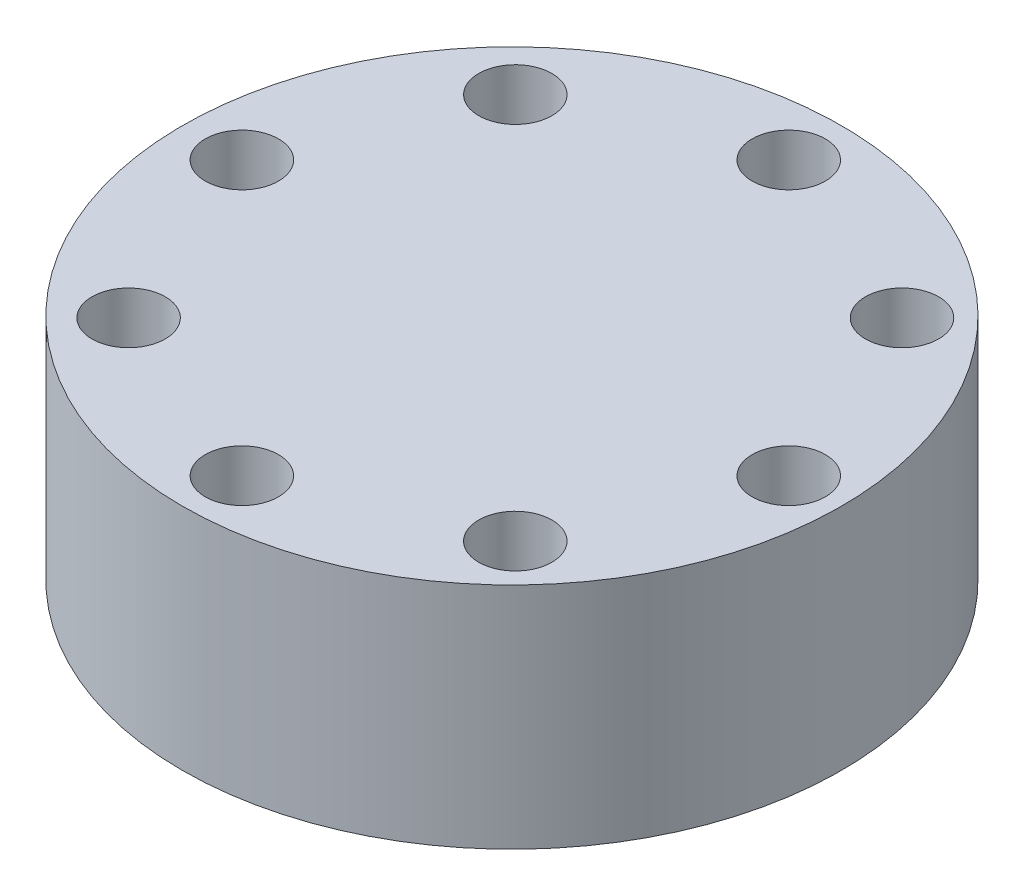
ISO-10303-21;
HEADER;
FILE_DESCRIPTION(('STEP AP214'),'2;1');
FILE_NAME('part.step','',(''),(''),'','','');
FILE_SCHEMA(('AUTOMOTIVE_DESIGN { 1 0 10303 214 1 1 1 1 }'));
ENDSEC;
DATA;
#1=APPLICATION_CONTEXT('core data for automotive mechanical design processes');
#2=APPLICATION_PROTOCOL_DEFINITION('international standard','automotive_design',2000,#1);
#3=PRODUCT_CONTEXT('',#1,'mechanical');
#4=PRODUCT('Part','Part','',(#3));
#5=PRODUCT_RELATED_PRODUCT_CATEGORY('part','',(#4));
#6=PRODUCT_DEFINITION_FORMATION('','',#4);
#7=PRODUCT_DEFINITION_CONTEXT('part definition',#1,'design');
#8=PRODUCT_DEFINITION('design','',#6,#7);
#9=PRODUCT_DEFINITION_SHAPE('','',#8);
#10=(LENGTH_UNIT() NAMED_UNIT(*) SI_UNIT(.MILLI.,.METRE.));
#11=(NAMED_UNIT(*) PLANE_ANGLE_UNIT() SI_UNIT($,.RADIAN.));
#12=(NAMED_UNIT(*) SI_UNIT($,.STERADIAN.) SOLID_ANGLE_UNIT());
#13=UNCERTAINTY_MEASURE_WITH_UNIT(LENGTH_MEASURE(1.E-05),#10,'distance_accuracy_value','');
#14=(GEOMETRIC_REPRESENTATION_CONTEXT(3) GLOBAL_UNCERTAINTY_ASSIGNED_CONTEXT((#13)) GLOBAL_UNIT_ASSIGNED_CONTEXT((#10,
#11,#12)) REPRESENTATION_CONTEXT('',''));
#15=CARTESIAN_POINT('',(0.,0.,0.));
#16=DIRECTION('',(0.,0.,1.));
#17=DIRECTION('',(1.,0.,0.));
#18=AXIS2_PLACEMENT_3D('',#15,#16,#17);
#19=CARTESIAN_POINT('',(0.,25.,0.));
#20=DIRECTION('',(0.,-1.,0.));
#21=DIRECTION('',(0.,0.,-1.));
#22=AXIS2_PLACEMENT_3D('',#19,#20,#21);
#23=CYLINDRICAL_SURFACE('',#22,36.);
#24=CARTESIAN_POINT('',(0.,25.,0.));
#25=DIRECTION('',(0.,1.,0.));
#26=DIRECTION('',(0.,0.,1.));
#27=AXIS2_PLACEMENT_3D('',#24,#25,#26);
#28=CIRCLE('',#27,36.);
#29=CARTESIAN_POINT('',(0.,25.,36.));
#30=VERTEX_POINT('',#29);
#31=EDGE_CURVE('E10',#30,#30,#28,.T.);
#32=ORIENTED_EDGE('',*,*,#31,.F.);
#33=EDGE_LOOP('',(#32));
#34=FACE_BOUND('',#33,.T.);
#35=CARTESIAN_POINT('',(0.,0.,0.));
#36=DIRECTION('',(0.,1.,0.));
#37=DIRECTION('',(0.,0.,1.));
#38=AXIS2_PLACEMENT_3D('',#35,#36,#37);
#39=CIRCLE('',#38,36.);
#40=CARTESIAN_POINT('',(0.,0.,36.));
#41=VERTEX_POINT('',#40);
#42=EDGE_CURVE('E44',#41,#41,#39,.T.);
#43=ORIENTED_EDGE('',*,*,#42,.T.);
#44=EDGE_LOOP('',(#43));
#45=FACE_BOUND('',#44,.T.);
#46=ADVANCED_FACE('F41',(#34,#45),#23,.T.);
#47=CARTESIAN_POINT('',(0.,25.,0.));
#48=DIRECTION('',(0.,1.,0.));
#49=DIRECTION('',(0.,0.,1.));
#50=AXIS2_PLACEMENT_3D('',#47,#48,#49);
#51=PLANE('',#50);
#52=CARTESIAN_POINT('',(0.368750000000097,25.,29.86875));
#53=DIRECTION('',(0.,1.,0.));
#54=DIRECTION('',(1.,0.,0.));
#55=AXIS2_PLACEMENT_3D('',#52,#53,#54);
#56=CIRCLE('',#55,4.);
#57=CARTESIAN_POINT('',(4.3687500000001,25.,29.86875));
#58=VERTEX_POINT('',#57);
#59=EDGE_CURVE('E96',#58,#58,#56,.T.);
#60=ORIENTED_EDGE('',*,*,#59,.F.);
#61=EDGE_LOOP('',(#60));
#62=FACE_BOUND('',#61,.T.);
#63=CARTESIAN_POINT('',(21.4891456705658,25.,21.1203956705656));
#64=DIRECTION('',(0.,1.,0.));
#65=DIRECTION('',(0.707106781186544,0.,-0.707106781186551));
#66=AXIS2_PLACEMENT_3D('',#63,#64,#65);
#67=CIRCLE('',#66,4.);
#68=CARTESIAN_POINT('',(24.317572795312,25.,18.2919685458194));
#69=VERTEX_POINT('',#68);
#70=EDGE_CURVE('E88',#69,#69,#67,.T.);
#71=ORIENTED_EDGE('',*,*,#70,.F.);
#72=EDGE_LOOP('',(#71));
#73=FACE_BOUND('',#72,.T.);
#74=CARTESIAN_POINT('',(30.2375,25.,0.));
#75=DIRECTION('',(0.,1.,0.));
#76=DIRECTION('',(0.,0.,-1.));
#77=AXIS2_PLACEMENT_3D('',#74,#75,#76);
#78=CIRCLE('',#77,4.);
#79=CARTESIAN_POINT('',(30.2375,25.,-3.99999999999999));
#80=VERTEX_POINT('',#79);
#81=EDGE_CURVE('E80',#80,#80,#78,.T.);
#82=ORIENTED_EDGE('',*,*,#81,.F.);
#83=EDGE_LOOP('',(#82));
#84=FACE_BOUND('',#83,.T.);
#85=CARTESIAN_POINT('',(21.4891456705655,25.,-21.1203956705659));
#86=DIRECTION('',(0.,1.,0.));
#87=DIRECTION('',(-0.707106781186554,0.,-0.707106781186541));
#88=AXIS2_PLACEMENT_3D('',#85,#86,#87);
#89=CIRCLE('',#88,4.);
#90=CARTESIAN_POINT('',(18.6607185458193,25.,-23.948822795312));
#91=VERTEX_POINT('',#90);
#92=EDGE_CURVE('E71',#91,#91,#89,.T.);
#93=ORIENTED_EDGE('',*,*,#92,.F.);
#94=EDGE_LOOP('',(#93));
#95=FACE_BOUND('',#94,.T.);
#96=CARTESIAN_POINT('',(0.368749999999693,25.,-29.86875));
#97=DIRECTION('',(0.,1.,0.));
#98=DIRECTION('',(-1.,0.,0.));
#99=AXIS2_PLACEMENT_3D('',#96,#97,#98);
#100=CIRCLE('',#99,4.);
#101=CARTESIAN_POINT('',(-3.63125000000031,25.,-29.86875));
#102=VERTEX_POINT('',#101);
#103=EDGE_CURVE('E111',#102,#102,#100,.T.);
#104=ORIENTED_EDGE('',*,*,#103,.F.);
#105=EDGE_LOOP('',(#104));
#106=FACE_BOUND('',#105,.T.);
#107=CARTESIAN_POINT('',(-20.7516456705659,25.,-21.1203956705654));
#108=DIRECTION('',(0.,1.,0.));
#109=DIRECTION('',(-0.707106781186539,0.,0.707106781186556));
#110=AXIS2_PLACEMENT_3D('',#107,#108,#109);
#111=CIRCLE('',#110,4.);
#112=CARTESIAN_POINT('',(-23.5800727953121,25.,-18.2919685458192));
#113=VERTEX_POINT('',#112);
#114=EDGE_CURVE('E103',#113,#113,#111,.T.);
#115=ORIENTED_EDGE('',*,*,#114,.F.);
#116=EDGE_LOOP('',(#115));
#117=FACE_BOUND('',#116,.T.);
#118=CARTESIAN_POINT('',(-20.7516456705657,25.,21.1203956705657));
#119=DIRECTION('',(0.,1.,0.));
#120=DIRECTION('',(0.707106781186549,0.,0.707106781186546));
#121=AXIS2_PLACEMENT_3D('',#118,#119,#120);
#122=CIRCLE('',#121,4.);
#123=CARTESIAN_POINT('',(-17.9232185458195,25.,23.9488227953119));
#124=VERTEX_POINT('',#123);
#125=EDGE_CURVE('E63',#124,#124,#122,.T.);
#126=ORIENTED_EDGE('',*,*,#125,.F.);
#127=EDGE_LOOP('',(#126));
#128=FACE_BOUND('',#127,.T.);
#129=CARTESIAN_POINT('',(-29.5,25.,0.));
#130=DIRECTION('',(0.,1.,0.));
#131=DIRECTION('',(0.,0.,1.));
#132=AXIS2_PLACEMENT_3D('',#129,#130,#131);
#133=CIRCLE('',#132,4.);
#134=CARTESIAN_POINT('',(-29.5,25.,4.));
#135=VERTEX_POINT('',#134);
#136=EDGE_CURVE('E55',#135,#135,#133,.T.);
#137=ORIENTED_EDGE('',*,*,#136,.F.);
#138=EDGE_LOOP('',(#137));
#139=FACE_BOUND('',#138,.T.);
#140=ORIENTED_EDGE('',*,*,#31,.T.);
#141=EDGE_LOOP('',(#140));
#142=FACE_BOUND('',#141,.T.);
#143=ADVANCED_FACE('F130',(#62,#73,#84,#95,#106,#117,#128,#139,#142),#51,.T.);
#144=CARTESIAN_POINT('',(0.,0.,0.));
#145=DIRECTION('',(0.,1.,0.));
#146=DIRECTION('',(0.,0.,1.));
#147=AXIS2_PLACEMENT_3D('',#144,#145,#146);
#148=PLANE('',#147);
#149=CARTESIAN_POINT('',(0.368750000000097,0.,29.86875));
#150=DIRECTION('',(0.,1.,0.));
#151=DIRECTION('',(1.,0.,0.));
#152=AXIS2_PLACEMENT_3D('',#149,#150,#151);
#153=CIRCLE('',#152,4.);
#154=CARTESIAN_POINT('',(4.3687500000001,0.,29.86875));
#155=VERTEX_POINT('',#154);
#156=EDGE_CURVE('E67',#155,#155,#153,.T.);
#157=ORIENTED_EDGE('',*,*,#156,.T.);
#158=EDGE_LOOP('',(#157));
#159=FACE_BOUND('',#158,.T.);
#160=CARTESIAN_POINT('',(21.4891456705658,0.,21.1203956705656));
#161=DIRECTION('',(0.,1.,0.));
#162=DIRECTION('',(0.707106781186544,0.,-0.707106781186551));
#163=AXIS2_PLACEMENT_3D('',#160,#161,#162);
#164=CIRCLE('',#163,4.);
#165=CARTESIAN_POINT('',(24.317572795312,0.,18.2919685458194));
#166=VERTEX_POINT('',#165);
#167=EDGE_CURVE('E92',#166,#166,#164,.T.);
#168=ORIENTED_EDGE('',*,*,#167,.T.);
#169=EDGE_LOOP('',(#168));
#170=FACE_BOUND('',#169,.T.);
#171=CARTESIAN_POINT('',(30.2375,0.,0.));
#172=DIRECTION('',(0.,1.,0.));
#173=DIRECTION('',(0.,0.,-1.));
#174=AXIS2_PLACEMENT_3D('',#171,#172,#173);
#175=CIRCLE('',#174,4.);
#176=CARTESIAN_POINT('',(30.2375,0.,-3.99999999999999));
#177=VERTEX_POINT('',#176);
#178=EDGE_CURVE('E84',#177,#177,#175,.T.);
#179=ORIENTED_EDGE('',*,*,#178,.T.);
#180=EDGE_LOOP('',(#179));
#181=FACE_BOUND('',#180,.T.);
#182=CARTESIAN_POINT('',(21.4891456705655,0.,-21.1203956705659));
#183=DIRECTION('',(0.,1.,0.));
#184=DIRECTION('',(-0.707106781186554,0.,-0.707106781186541));
#185=AXIS2_PLACEMENT_3D('',#182,#183,#184);
#186=CIRCLE('',#185,4.);
#187=CARTESIAN_POINT('',(18.6607185458193,0.,-23.948822795312));
#188=VERTEX_POINT('',#187);
#189=EDGE_CURVE('E75',#188,#188,#186,.T.);
#190=ORIENTED_EDGE('',*,*,#189,.T.);
#191=EDGE_LOOP('',(#190));
#192=FACE_BOUND('',#191,.T.);
#193=CARTESIAN_POINT('',(0.368749999999693,0.,-29.86875));
#194=DIRECTION('',(0.,1.,0.));
#195=DIRECTION('',(-1.,0.,0.));
#196=AXIS2_PLACEMENT_3D('',#193,#194,#195);
#197=CIRCLE('',#196,4.);
#198=CARTESIAN_POINT('',(-3.63125000000031,0.,-29.86875));
#199=VERTEX_POINT('',#198);
#200=EDGE_CURVE('E76',#199,#199,#197,.T.);
#201=ORIENTED_EDGE('',*,*,#200,.T.);
#202=EDGE_LOOP('',(#201));
#203=FACE_BOUND('',#202,.T.);
#204=CARTESIAN_POINT('',(-20.7516456705659,0.,-21.1203956705654));
#205=DIRECTION('',(0.,1.,0.));
#206=DIRECTION('',(-0.707106781186539,0.,0.707106781186556));
#207=AXIS2_PLACEMENT_3D('',#204,#205,#206);
#208=CIRCLE('',#207,4.);
#209=CARTESIAN_POINT('',(-23.5800727953121,0.,-18.2919685458192));
#210=VERTEX_POINT('',#209);
#211=EDGE_CURVE('E107',#210,#210,#208,.T.);
#212=ORIENTED_EDGE('',*,*,#211,.T.);
#213=EDGE_LOOP('',(#212));
#214=FACE_BOUND('',#213,.T.);
#215=CARTESIAN_POINT('',(-20.7516456705657,0.,21.1203956705657));
#216=DIRECTION('',(0.,1.,0.));
#217=DIRECTION('',(0.707106781186549,0.,0.707106781186546));
#218=AXIS2_PLACEMENT_3D('',#215,#216,#217);
#219=CIRCLE('',#218,4.);
#220=CARTESIAN_POINT('',(-17.9232185458195,0.,23.9488227953119));
#221=VERTEX_POINT('',#220);
#222=EDGE_CURVE('E59',#221,#221,#219,.T.);
#223=ORIENTED_EDGE('',*,*,#222,.T.);
#224=EDGE_LOOP('',(#223));
#225=FACE_BOUND('',#224,.T.);
#226=CARTESIAN_POINT('',(-29.5,0.,0.));
#227=DIRECTION('',(0.,1.,0.));
#228=DIRECTION('',(0.,0.,1.));
#229=AXIS2_PLACEMENT_3D('',#226,#227,#228);
#230=CIRCLE('',#229,4.);
#231=CARTESIAN_POINT('',(-29.5,0.,4.));
#232=VERTEX_POINT('',#231);
#233=EDGE_CURVE('E53',#232,#232,#230,.T.);
#234=ORIENTED_EDGE('',*,*,#233,.T.);
#235=EDGE_LOOP('',(#234));
#236=FACE_BOUND('',#235,.T.);
#237=ORIENTED_EDGE('',*,*,#42,.F.);
#238=EDGE_LOOP('',(#237));
#239=FACE_BOUND('',#238,.T.);
#240=ADVANCED_FACE('F119',(#159,#170,#181,#192,#203,#214,#225,#236,#239),#148,.F.);
#241=CARTESIAN_POINT('',(-29.5,0.,0.));
#242=DIRECTION('',(0.,1.,0.));
#243=DIRECTION('',(0.,0.,1.));
#244=AXIS2_PLACEMENT_3D('',#241,#242,#243);
#245=CYLINDRICAL_SURFACE('',#244,4.);
#246=ORIENTED_EDGE('',*,*,#233,.F.);
#247=EDGE_LOOP('',(#246));
#248=FACE_BOUND('',#247,.T.);
#249=ORIENTED_EDGE('',*,*,#136,.T.);
#250=EDGE_LOOP('',(#249));
#251=FACE_BOUND('',#250,.T.);
#252=ADVANCED_FACE('F141',(#248,#251),#245,.F.);
#253=CARTESIAN_POINT('',(-20.7516456705657,0.,21.1203956705657));
#254=DIRECTION('',(0.,1.,0.));
#255=DIRECTION('',(0.,0.,1.));
#256=AXIS2_PLACEMENT_3D('',#253,#254,#255);
#257=CYLINDRICAL_SURFACE('',#256,4.);
#258=ORIENTED_EDGE('',*,*,#222,.F.);
#259=EDGE_LOOP('',(#258));
#260=FACE_BOUND('',#259,.T.);
#261=ORIENTED_EDGE('',*,*,#125,.T.);
#262=EDGE_LOOP('',(#261));
#263=FACE_BOUND('',#262,.T.);
#264=ADVANCED_FACE('F143',(#260,#263),#257,.F.);
#265=CARTESIAN_POINT('',(-20.7516456705659,0.,-21.1203956705654));
#266=DIRECTION('',(0.,1.,0.));
#267=DIRECTION('',(0.,0.,1.));
#268=AXIS2_PLACEMENT_3D('',#265,#266,#267);
#269=CYLINDRICAL_SURFACE('',#268,4.);
#270=ORIENTED_EDGE('',*,*,#211,.F.);
#271=EDGE_LOOP('',(#270));
#272=FACE_BOUND('',#271,.T.);
#273=ORIENTED_EDGE('',*,*,#114,.T.);
#274=EDGE_LOOP('',(#273));
#275=FACE_BOUND('',#274,.T.);
#276=ADVANCED_FACE('F126',(#272,#275),#269,.F.);
#277=CARTESIAN_POINT('',(0.368749999999693,0.,-29.86875));
#278=DIRECTION('',(0.,1.,0.));
#279=DIRECTION('',(0.,0.,1.));
#280=AXIS2_PLACEMENT_3D('',#277,#278,#279);
#281=CYLINDRICAL_SURFACE('',#280,4.);
#282=ORIENTED_EDGE('',*,*,#200,.F.);
#283=EDGE_LOOP('',(#282));
#284=FACE_BOUND('',#283,.T.);
#285=ORIENTED_EDGE('',*,*,#103,.T.);
#286=EDGE_LOOP('',(#285));
#287=FACE_BOUND('',#286,.T.);
#288=ADVANCED_FACE('F122',(#284,#287),#281,.F.);
#289=CARTESIAN_POINT('',(21.4891456705655,0.,-21.1203956705659));
#290=DIRECTION('',(0.,1.,0.));
#291=DIRECTION('',(0.,0.,1.));
#292=AXIS2_PLACEMENT_3D('',#289,#290,#291);
#293=CYLINDRICAL_SURFACE('',#292,4.);
#294=ORIENTED_EDGE('',*,*,#189,.F.);
#295=EDGE_LOOP('',(#294));
#296=FACE_BOUND('',#295,.T.);
#297=ORIENTED_EDGE('',*,*,#92,.T.);
#298=EDGE_LOOP('',(#297));
#299=FACE_BOUND('',#298,.T.);
#300=ADVANCED_FACE('F125',(#296,#299),#293,.F.);
#301=CARTESIAN_POINT('',(30.2375,0.,0.));
#302=DIRECTION('',(0.,1.,0.));
#303=DIRECTION('',(0.,0.,1.));
#304=AXIS2_PLACEMENT_3D('',#301,#302,#303);
#305=CYLINDRICAL_SURFACE('',#304,4.);
#306=ORIENTED_EDGE('',*,*,#178,.F.);
#307=EDGE_LOOP('',(#306));
#308=FACE_BOUND('',#307,.T.);
#309=ORIENTED_EDGE('',*,*,#81,.T.);
#310=EDGE_LOOP('',(#309));
#311=FACE_BOUND('',#310,.T.);
#312=ADVANCED_FACE('F204',(#308,#311),#305,.F.);
#313=CARTESIAN_POINT('',(21.4891456705658,0.,21.1203956705656));
#314=DIRECTION('',(0.,1.,0.));
#315=DIRECTION('',(0.,0.,1.));
#316=AXIS2_PLACEMENT_3D('',#313,#314,#315);
#317=CYLINDRICAL_SURFACE('',#316,4.);
#318=ORIENTED_EDGE('',*,*,#167,.F.);
#319=EDGE_LOOP('',(#318));
#320=FACE_BOUND('',#319,.T.);
#321=ORIENTED_EDGE('',*,*,#70,.T.);
#322=EDGE_LOOP('',(#321));
#323=FACE_BOUND('',#322,.T.);
#324=ADVANCED_FACE('F215',(#320,#323),#317,.F.);
#325=CARTESIAN_POINT('',(0.368750000000097,0.,29.86875));
#326=DIRECTION('',(0.,1.,0.));
#327=DIRECTION('',(0.,0.,1.));
#328=AXIS2_PLACEMENT_3D('',#325,#326,#327);
#329=CYLINDRICAL_SURFACE('',#328,4.);
#330=ORIENTED_EDGE('',*,*,#156,.F.);
#331=EDGE_LOOP('',(#330));
#332=FACE_BOUND('',#331,.T.);
#333=ORIENTED_EDGE('',*,*,#59,.T.);
#334=EDGE_LOOP('',(#333));
#335=FACE_BOUND('',#334,.T.);
#336=ADVANCED_FACE('F226',(#332,#335),#329,.F.);
#337=CLOSED_SHELL('',(#46,#143,#240,#252,#264,#276,#288,#300,#312,#324,#336));
#338=MANIFOLD_SOLID_BREP('B2',#337);
#339=ADVANCED_BREP_SHAPE_REPRESENTATION('',(#18,#338),#14);
#340=SHAPE_DEFINITION_REPRESENTATION(#9,#339);
ENDSEC;
END-ISO-10303-21;
